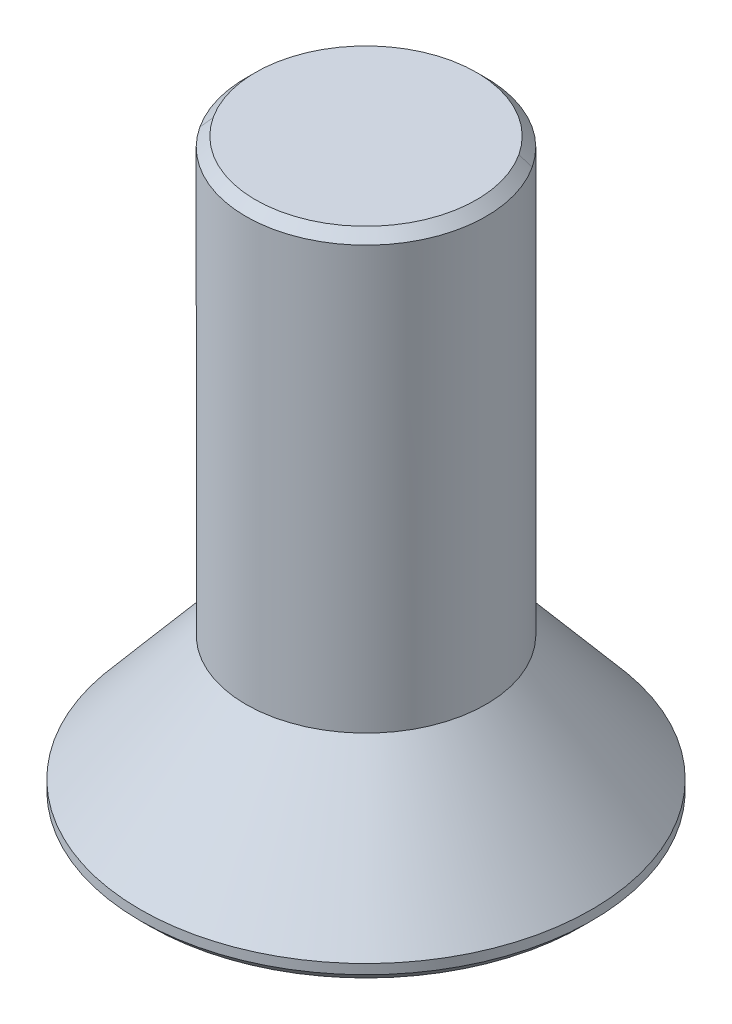
ISO-10303-21;
HEADER;
FILE_DESCRIPTION(('STEP AP214'),'2;1');
FILE_NAME('part.step','',(''),(''),'','','');
FILE_SCHEMA(('AUTOMOTIVE_DESIGN { 1 0 10303 214 1 1 1 1 }'));
ENDSEC;
DATA;
#1=APPLICATION_CONTEXT('core data for automotive mechanical design processes');
#2=APPLICATION_PROTOCOL_DEFINITION('international standard','automotive_design',2000,#1);
#3=PRODUCT_CONTEXT('',#1,'mechanical');
#4=PRODUCT('Part','Part','',(#3));
#5=PRODUCT_RELATED_PRODUCT_CATEGORY('part','',(#4));
#6=PRODUCT_DEFINITION_FORMATION('','',#4);
#7=PRODUCT_DEFINITION_CONTEXT('part definition',#1,'design');
#8=PRODUCT_DEFINITION('design','',#6,#7);
#9=PRODUCT_DEFINITION_SHAPE('','',#8);
#10=(LENGTH_UNIT() NAMED_UNIT(*) SI_UNIT(.MILLI.,.METRE.));
#11=(NAMED_UNIT(*) PLANE_ANGLE_UNIT() SI_UNIT($,.RADIAN.));
#12=(NAMED_UNIT(*) SI_UNIT($,.STERADIAN.) SOLID_ANGLE_UNIT());
#13=UNCERTAINTY_MEASURE_WITH_UNIT(LENGTH_MEASURE(1.E-05),#10,'distance_accuracy_value','');
#14=(GEOMETRIC_REPRESENTATION_CONTEXT(3) GLOBAL_UNCERTAINTY_ASSIGNED_CONTEXT((#13)) GLOBAL_UNIT_ASSIGNED_CONTEXT((#10,
#11,#12)) REPRESENTATION_CONTEXT('',''));
#15=CARTESIAN_POINT('',(0.,0.,0.));
#16=DIRECTION('',(0.,0.,1.));
#17=DIRECTION('',(1.,0.,0.));
#18=AXIS2_PLACEMENT_3D('',#15,#16,#17);
#19=CARTESIAN_POINT('',(11.9,-98.6,10.95));
#20=DIRECTION('',(0.,1.,0.));
#21=DIRECTION('',(0.,0.,1.));
#22=AXIS2_PLACEMENT_3D('',#19,#20,#21);
#23=PLANE('',#22);
#24=DIRECTION('',(0.892252070642868,0.,0.451537642321784));
#25=VECTOR('',#24,1.);
#26=CARTESIAN_POINT('',(11.01856332094,-98.6,11.14837237246));
#27=LINE('',#26,#25);
#28=CARTESIAN_POINT('',(11.2153737278014,-98.6,11.2479712526672));
#29=VERTEX_POINT('',#28);
#30=CARTESIAN_POINT('',(10.8217529140776,-98.6,11.0487734922547));
#31=VERTEX_POINT('',#30);
#32=EDGE_CURVE('E336',#29,#31,#27,.F.);
#33=ORIENTED_EDGE('',*,*,#32,.T.);
#34=CARTESIAN_POINT('',(10.84432979619,-98.6,11.00416088872));
#35=DIRECTION('',(0.,-1.,0.));
#36=DIRECTION('',(0.,0.,-1.));
#37=AXIS2_PLACEMENT_3D('',#34,#35,#36);
#38=CIRCLE('',#37,0.05000000000277);
#39=CARTESIAN_POINT('',(10.8169825892633,-98.6,10.9623024335125));
#40=VERTEX_POINT('',#39);
#41=EDGE_CURVE('E289',#31,#40,#38,.T.);
#42=ORIENTED_EDGE('',*,*,#41,.T.);
#43=DIRECTION('',(0.837169104324096,0.,-0.546944138614897));
#44=VECTOR('',#43,1.);
#45=CARTESIAN_POINT('',(11.00164295314,-98.6,10.84165906154));
#46=LINE('',#45,#44);
#47=CARTESIAN_POINT('',(11.1863033170238,-98.6,10.7210156895684));
#48=VERTEX_POINT('',#47);
#49=EDGE_CURVE('E291',#48,#40,#46,.F.);
#50=ORIENTED_EDGE('',*,*,#49,.F.);
#51=CARTESIAN_POINT('',(11.04956728237,-98.6,10.51172341348));
#52=DIRECTION('',(0.,-1.,0.));
#53=DIRECTION('',(0.,0.,-1.));
#54=AXIS2_PLACEMENT_3D('',#51,#52,#53);
#55=CIRCLE('',#54,0.2500000000109);
#56=CARTESIAN_POINT('',(11.2991877275952,-98.6,10.4979526719071));
#57=VERTEX_POINT('',#56);
#58=EDGE_CURVE('E284',#57,#48,#55,.T.);
#59=ORIENTED_EDGE('',*,*,#58,.F.);
#60=DIRECTION('',(-0.0550829663049418,0.,-0.998481780916932));
#61=VECTOR('',#60,1.);
#62=CARTESIAN_POINT('',(11.28748614651,-98.6,10.28583963034));
#63=LINE('',#62,#61);
#64=CARTESIAN_POINT('',(11.275784565423,-98.6,10.0737265887676));
#65=VERTEX_POINT('',#64);
#66=EDGE_CURVE('E330',#65,#57,#63,.F.);
#67=ORIENTED_EDGE('',*,*,#66,.F.);
#68=CARTESIAN_POINT('',(11.32570865447,-98.6,10.07097244045));
#69=DIRECTION('',(0.,-1.,0.));
#70=DIRECTION('',(0.,0.,-1.));
#71=AXIS2_PLACEMENT_3D('',#68,#69,#70);
#72=CIRCLE('',#71,0.05000000000277);
#73=CARTESIAN_POINT('',(11.3482855365822,-98.6,10.0263598369199));
#74=VERTEX_POINT('',#73);
#75=EDGE_CURVE('E193',#65,#74,#72,.T.);
#76=ORIENTED_EDGE('',*,*,#75,.T.);
#77=DIRECTION('',(0.892252070648825,0.,0.451537642310013));
#78=VECTOR('',#77,1.);
#79=CARTESIAN_POINT('',(11.53783160959,-98.6,10.12228249122));
#80=LINE('',#79,#78);
#81=CARTESIAN_POINT('',(11.7273776826113,-98.6,10.218205145518));
#82=VERTEX_POINT('',#81);
#83=EDGE_CURVE('E189',#82,#74,#80,.F.);
#84=ORIENTED_EDGE('',*,*,#83,.F.);
#85=CARTESIAN_POINT('',(11.84026209319,-98.6,9.995142127854));
#86=DIRECTION('',(0.,-1.,0.));
#87=DIRECTION('',(0.,0.,-1.));
#88=AXIS2_PLACEMENT_3D('',#85,#86,#87);
#89=CIRCLE('',#88,0.2500000000004);
#90=CARTESIAN_POINT('',(11.9769981278429,-98.6,10.2044344039408));
#91=VERTEX_POINT('',#90);
#92=EDGE_CURVE('E20',#91,#82,#89,.T.);
#93=ORIENTED_EDGE('',*,*,#92,.F.);
#94=DIRECTION('',(0.837169104328085,0.,-0.54694413860879));
#95=VECTOR('',#94,1.);
#96=CARTESIAN_POINT('',(12.16165849172,-98.6,10.08379103197));
#97=LINE('',#96,#95);
#98=CARTESIAN_POINT('',(12.3463188555998,-98.6,9.96314765999378));
#99=VERTEX_POINT('',#98);
#100=EDGE_CURVE('E204',#99,#91,#97,.F.);
#101=ORIENTED_EDGE('',*,*,#100,.F.);
#102=CARTESIAN_POINT('',(12.37366606253,-98.6,10.00500611521));
#103=DIRECTION('',(0.,-1.,0.));
#104=DIRECTION('',(0.,0.,-1.));
#105=AXIS2_PLACEMENT_3D('',#102,#103,#104);
#106=CIRCLE('',#105,0.05000000000277);
#107=CARTESIAN_POINT('',(12.423590151574,-98.6,10.0022519668923));
#108=VERTEX_POINT('',#107);
#109=EDGE_CURVE('E323',#99,#108,#106,.T.);
#110=ORIENTED_EDGE('',*,*,#109,.T.);
#111=DIRECTION('',(-0.0550829663170281,0.,-0.998481780916265));
#112=VECTOR('',#111,1.);
#113=CARTESIAN_POINT('',(12.43574019456,-98.6,10.22249421908));
#114=LINE('',#113,#112);
#115=CARTESIAN_POINT('',(12.4478902375452,-98.6,10.4427364712499));
#116=VERTEX_POINT('',#115);
#117=EDGE_CURVE('E221',#108,#116,#114,.F.);
#118=ORIENTED_EDGE('',*,*,#117,.T.);
#119=CARTESIAN_POINT('',(12.69751068278,-98.6,10.42896572967));
#120=DIRECTION('',(0.,-1.,0.));
#121=DIRECTION('',(0.,0.,-1.));
#122=AXIS2_PLACEMENT_3D('',#119,#120,#121);
#123=CIRCLE('',#122,0.2500000000055);
#124=CARTESIAN_POINT('',(12.5846262721986,-98.6,10.6520287473328));
#125=VERTEX_POINT('',#124);
#126=EDGE_CURVE('E320',#125,#116,#123,.T.);
#127=ORIENTED_EDGE('',*,*,#126,.F.);
#128=DIRECTION('',(0.892252070642868,0.,0.451537642321784));
#129=VECTOR('',#128,1.);
#130=CARTESIAN_POINT('',(12.78143667906,-98.6,10.75162762754));
#131=LINE('',#130,#129);
#132=CARTESIAN_POINT('',(12.9782470859224,-98.6,10.8512265077453));
#133=VERTEX_POINT('',#132);
#134=EDGE_CURVE('E349',#133,#125,#131,.F.);
#135=ORIENTED_EDGE('',*,*,#134,.F.);
#136=CARTESIAN_POINT('',(12.95567020381,-98.6,10.89583911128));
#137=DIRECTION('',(0.,-1.,0.));
#138=DIRECTION('',(0.,0.,-1.));
#139=AXIS2_PLACEMENT_3D('',#136,#137,#138);
#140=CIRCLE('',#139,0.05000000000277);
#141=CARTESIAN_POINT('',(12.9830174107344,-98.6,10.937697566489));
#142=VERTEX_POINT('',#141);
#143=EDGE_CURVE('E316',#133,#142,#140,.T.);
#144=ORIENTED_EDGE('',*,*,#143,.T.);
#145=DIRECTION('',(0.837169104324096,0.,-0.546944138614897));
#146=VECTOR('',#145,1.);
#147=CARTESIAN_POINT('',(12.79835704686,-98.6,11.05834093846));
#148=LINE('',#147,#146);
#149=CARTESIAN_POINT('',(12.6136966829777,-98.6,11.1789843104388));
#150=VERTEX_POINT('',#149);
#151=EDGE_CURVE('E315',#142,#150,#148,.F.);
#152=ORIENTED_EDGE('',*,*,#151,.T.);
#153=CARTESIAN_POINT('',(12.75043271763,-98.6,11.38827658652));
#154=DIRECTION('',(0.,-1.,0.));
#155=DIRECTION('',(0.,0.,-1.));
#156=AXIS2_PLACEMENT_3D('',#153,#154,#155);
#157=CIRCLE('',#156,0.2499999999971);
#158=CARTESIAN_POINT('',(12.5008122724051,-98.6,11.4020473280979));
#159=VERTEX_POINT('',#158);
#160=EDGE_CURVE('E311',#159,#150,#157,.T.);
#161=ORIENTED_EDGE('',*,*,#160,.F.);
#162=DIRECTION('',(-0.0550829663049418,0.,-0.998481780916932));
#163=VECTOR('',#162,1.);
#164=CARTESIAN_POINT('',(12.51251385349,-98.6,11.61416036966));
#165=LINE('',#164,#163);
#166=CARTESIAN_POINT('',(12.5242154345728,-98.6,11.8262734112327));
#167=VERTEX_POINT('',#166);
#168=EDGE_CURVE('E346',#159,#167,#165,.F.);
#169=ORIENTED_EDGE('',*,*,#168,.T.);
#170=CARTESIAN_POINT('',(12.47429134553,-98.6,11.82902755955));
#171=DIRECTION('',(0.,-1.,0.));
#172=DIRECTION('',(0.,0.,-1.));
#173=AXIS2_PLACEMENT_3D('',#170,#171,#172);
#174=CIRCLE('',#173,0.0499999999944);
#175=CARTESIAN_POINT('',(12.4517144634186,-98.6,11.8736401630785));
#176=VERTEX_POINT('',#175);
#177=EDGE_CURVE('E307',#167,#176,#174,.T.);
#178=ORIENTED_EDGE('',*,*,#177,.T.);
#179=DIRECTION('',(0.892252070648825,0.,0.451537642310013));
#180=VECTOR('',#179,1.);
#181=CARTESIAN_POINT('',(12.2621683904,-98.6,11.77771750878));
#182=LINE('',#181,#180);
#183=CARTESIAN_POINT('',(12.0726223173888,-98.6,11.6817948544838));
#184=VERTEX_POINT('',#183);
#185=EDGE_CURVE('E306',#176,#184,#182,.F.);
#186=ORIENTED_EDGE('',*,*,#185,.T.);
#187=CARTESIAN_POINT('',(11.95973790681,-98.6,11.90485787215));
#188=DIRECTION('',(0.,-1.,0.));
#189=DIRECTION('',(0.,0.,-1.));
#190=AXIS2_PLACEMENT_3D('',#187,#188,#189);
#191=CIRCLE('',#190,0.2500000000055);
#192=CARTESIAN_POINT('',(11.8230018721545,-98.6,11.6955655960589));
#193=VERTEX_POINT('',#192);
#194=EDGE_CURVE('E302',#193,#184,#191,.T.);
#195=ORIENTED_EDGE('',*,*,#194,.F.);
#196=DIRECTION('',(0.837169104324096,0.,-0.546944138614897));
#197=VECTOR('',#196,1.);
#198=CARTESIAN_POINT('',(11.63834150828,-98.6,11.81620896803));
#199=LINE('',#198,#197);
#200=CARTESIAN_POINT('',(11.4536811443999,-98.6,11.9368523400074));
#201=VERTEX_POINT('',#200);
#202=EDGE_CURVE('E341',#193,#201,#199,.F.);
#203=ORIENTED_EDGE('',*,*,#202,.T.);
#204=CARTESIAN_POINT('',(11.42633393747,-98.6,11.89499388479));
#205=DIRECTION('',(0.,-1.,0.));
#206=DIRECTION('',(0.,0.,-1.));
#207=AXIS2_PLACEMENT_3D('',#204,#205,#206);
#208=CIRCLE('',#207,0.05000000000277);
#209=CARTESIAN_POINT('',(11.3764098484256,-98.6,11.8977480331027));
#210=VERTEX_POINT('',#209);
#211=EDGE_CURVE('E298',#201,#210,#208,.T.);
#212=ORIENTED_EDGE('',*,*,#211,.T.);
#213=DIRECTION('',(-0.0550829663167888,0.,-0.998481780916279));
#214=VECTOR('',#213,1.);
#215=CARTESIAN_POINT('',(11.36425980544,-98.6,11.67750578092));
#216=LINE('',#215,#214);
#217=CARTESIAN_POINT('',(11.3521097624506,-98.6,11.4572635287503));
#218=VERTEX_POINT('',#217);
#219=EDGE_CURVE('E300',#218,#210,#216,.F.);
#220=ORIENTED_EDGE('',*,*,#219,.F.);
#221=CARTESIAN_POINT('',(11.10248931722,-98.6,11.47103427033));
#222=DIRECTION('',(0.,-1.,0.));
#223=DIRECTION('',(0.,0.,-1.));
#224=AXIS2_PLACEMENT_3D('',#221,#222,#223);
#225=CIRCLE('',#224,0.2499999999971);
#226=EDGE_CURVE('E293',#29,#218,#225,.T.);
#227=ORIENTED_EDGE('',*,*,#226,.F.);
#228=EDGE_LOOP('',(#33,#42,#50,#59,#67,#76,#84,#93,#101,#110,#118,#127,#135,#144,#152,#161,#169,
#178,#186,#195,#203,#212,#220,#227));
#229=FACE_BOUND('',#228,.T.);
#230=ADVANCED_FACE('F17',(#229),#23,.F.);
#231=CARTESIAN_POINT('',(11.53783160959,-99.2,10.12228249122));
#232=DIRECTION('',(-0.451537642310013,0.,0.892252070648825));
#233=DIRECTION('',(0.892252070648825,0.,0.451537642310013));
#234=AXIS2_PLACEMENT_3D('',#231,#232,#233);
#235=PLANE('',#234);
#236=DIRECTION('',(0.,-1.,0.));
#237=VECTOR('',#236,1.);
#238=CARTESIAN_POINT('',(11.3482855365834,-98.576,10.0263598369134));
#239=LINE('',#238,#237);
#240=CARTESIAN_POINT('',(11.3482855365837,-99.8,10.0263598369177));
#241=VERTEX_POINT('',#240);
#242=EDGE_CURVE('E282',#74,#241,#239,.T.);
#243=ORIENTED_EDGE('',*,*,#242,.T.);
#244=DIRECTION('',(0.892252070642463,0.,0.451537642322584));
#245=VECTOR('',#244,1.);
#246=CARTESIAN_POINT('',(11.34828553658,-99.8,10.02635983692));
#247=LINE('',#246,#245);
#248=CARTESIAN_POINT('',(11.7273776826096,-99.8,10.2182051455175));
#249=VERTEX_POINT('',#248);
#250=EDGE_CURVE('E201',#241,#249,#247,.T.);
#251=ORIENTED_EDGE('',*,*,#250,.T.);
#252=DIRECTION('',(0.,-1.,0.));
#253=VECTOR('',#252,1.);
#254=CARTESIAN_POINT('',(11.7273776826119,-98.576,10.2182051455163));
#255=LINE('',#254,#253);
#256=EDGE_CURVE('E198',#82,#249,#255,.T.);
#257=ORIENTED_EDGE('',*,*,#256,.F.);
#258=ORIENTED_EDGE('',*,*,#83,.T.);
#259=EDGE_LOOP('',(#243,#251,#257,#258));
#260=FACE_BOUND('',#259,.T.);
#261=ADVANCED_FACE('F199',(#260),#235,.T.);
#262=CARTESIAN_POINT('',(11.84026209319,-98.576,9.995142127854));
#263=DIRECTION('',(0.,-1.,0.));
#264=DIRECTION('',(0.,0.,-1.));
#265=AXIS2_PLACEMENT_3D('',#262,#263,#264);
#266=CYLINDRICAL_SURFACE('',#265,0.2500000000004);
#267=ORIENTED_EDGE('',*,*,#256,.T.);
#268=CARTESIAN_POINT('',(11.84026209319,-99.8,9.995142127854));
#269=DIRECTION('',(0.,-1.,0.));
#270=DIRECTION('',(0.,0.,-1.));
#271=AXIS2_PLACEMENT_3D('',#268,#269,#270);
#272=CIRCLE('',#271,0.2500000000004);
#273=CARTESIAN_POINT('',(11.9769981278424,-99.8,10.2044344039398));
#274=VERTEX_POINT('',#273);
#275=EDGE_CURVE('E210',#249,#274,#272,.F.);
#276=ORIENTED_EDGE('',*,*,#275,.T.);
#277=DIRECTION('',(0.,1.,0.));
#278=VECTOR('',#277,1.);
#279=CARTESIAN_POINT('',(11.9769981278413,-99.2,10.2044344039419));
#280=LINE('',#279,#278);
#281=EDGE_CURVE('E208',#91,#274,#280,.F.);
#282=ORIENTED_EDGE('',*,*,#281,.F.);
#283=ORIENTED_EDGE('',*,*,#92,.T.);
#284=EDGE_LOOP('',(#267,#276,#282,#283));
#285=FACE_BOUND('',#284,.T.);
#286=ADVANCED_FACE('F206',(#285),#266,.T.);
#287=CARTESIAN_POINT('',(12.16165849172,-99.2,10.08379103197));
#288=DIRECTION('',(0.54694413860879,0.,0.837169104328085));
#289=DIRECTION('',(0.837169104328085,0.,-0.54694413860879));
#290=AXIS2_PLACEMENT_3D('',#287,#288,#289);
#291=PLANE('',#290);
#292=ORIENTED_EDGE('',*,*,#281,.T.);
#293=DIRECTION('',(0.83716910432753,0.,-0.546944138609641));
#294=VECTOR('',#293,1.);
#295=CARTESIAN_POINT('',(11.97699812784,-99.8,10.20443440394));
#296=LINE('',#295,#294);
#297=CARTESIAN_POINT('',(12.346318855599,-99.8,9.96314765999265));
#298=VERTEX_POINT('',#297);
#299=EDGE_CURVE('E279',#274,#298,#296,.T.);
#300=ORIENTED_EDGE('',*,*,#299,.T.);
#301=DIRECTION('',(0.,-1.,0.));
#302=VECTOR('',#301,1.);
#303=CARTESIAN_POINT('',(12.3463188555982,-98.576,9.9631476599912));
#304=LINE('',#303,#302);
#305=EDGE_CURVE('E214',#298,#99,#304,.F.);
#306=ORIENTED_EDGE('',*,*,#305,.T.);
#307=ORIENTED_EDGE('',*,*,#100,.T.);
#308=EDGE_LOOP('',(#292,#300,#306,#307));
#309=FACE_BOUND('',#308,.T.);
#310=ADVANCED_FACE('F217',(#309),#291,.T.);
#311=CARTESIAN_POINT('',(12.37366606253,-98.576,10.00500611521));
#312=DIRECTION('',(0.,-1.,0.));
#313=DIRECTION('',(0.,0.,-1.));
#314=AXIS2_PLACEMENT_3D('',#311,#312,#313);
#315=CYLINDRICAL_SURFACE('',#314,0.05000000000277);
#316=ORIENTED_EDGE('',*,*,#109,.F.);
#317=ORIENTED_EDGE('',*,*,#305,.F.);
#318=CARTESIAN_POINT('',(12.37366606253,-99.8,10.00500611521));
#319=DIRECTION('',(0.,-1.,0.));
#320=DIRECTION('',(0.,0.,-1.));
#321=AXIS2_PLACEMENT_3D('',#318,#319,#320);
#322=CIRCLE('',#321,0.05000000000277);
#323=CARTESIAN_POINT('',(12.4235901515771,-99.8,10.0022519668922));
#324=VERTEX_POINT('',#323);
#325=EDGE_CURVE('E277',#298,#324,#322,.T.);
#326=ORIENTED_EDGE('',*,*,#325,.T.);
#327=DIRECTION('',(0.,1.,0.));
#328=VECTOR('',#327,1.);
#329=CARTESIAN_POINT('',(12.4235901515739,-99.2,10.0022519668903));
#330=LINE('',#329,#328);
#331=EDGE_CURVE('E324',#324,#108,#330,.T.);
#332=ORIENTED_EDGE('',*,*,#331,.T.);
#333=EDGE_LOOP('',(#316,#317,#326,#332));
#334=FACE_BOUND('',#333,.T.);
#335=ADVANCED_FACE('F566',(#334),#315,.F.);
#336=CARTESIAN_POINT('',(12.43574019456,-99.2,10.22249421908));
#337=DIRECTION('',(0.998481780916265,0.,-0.0550829663170281));
#338=DIRECTION('',(-0.0550829663170281,0.,-0.998481780916265));
#339=AXIS2_PLACEMENT_3D('',#336,#337,#338);
#340=PLANE('',#339);
#341=ORIENTED_EDGE('',*,*,#117,.F.);
#342=ORIENTED_EDGE('',*,*,#331,.F.);
#343=DIRECTION('',(0.0550829663145629,0.,0.998481780916401));
#344=VECTOR('',#343,1.);
#345=CARTESIAN_POINT('',(12.42359015158,-99.8,10.00225196689));
#346=LINE('',#345,#344);
#347=CARTESIAN_POINT('',(12.4478902375477,-99.8,10.4427364712495));
#348=VERTEX_POINT('',#347);
#349=EDGE_CURVE('E276',#324,#348,#346,.T.);
#350=ORIENTED_EDGE('',*,*,#349,.T.);
#351=DIRECTION('',(0.,-1.,0.));
#352=VECTOR('',#351,1.);
#353=CARTESIAN_POINT('',(12.4478902375455,-98.576,10.4427364712503));
#354=LINE('',#353,#352);
#355=EDGE_CURVE('E322',#116,#348,#354,.T.);
#356=ORIENTED_EDGE('',*,*,#355,.F.);
#357=EDGE_LOOP('',(#341,#342,#350,#356));
#358=FACE_BOUND('',#357,.T.);
#359=ADVANCED_FACE('F563',(#358),#340,.F.);
#360=CARTESIAN_POINT('',(12.69751068278,-98.576,10.42896572967));
#361=DIRECTION('',(0.,-1.,0.));
#362=DIRECTION('',(0.,0.,-1.));
#363=AXIS2_PLACEMENT_3D('',#360,#361,#362);
#364=CYLINDRICAL_SURFACE('',#363,0.2500000000055);
#365=ORIENTED_EDGE('',*,*,#355,.T.);
#366=CARTESIAN_POINT('',(12.69751068278,-99.8,10.42896572967));
#367=DIRECTION('',(0.,-1.,0.));
#368=DIRECTION('',(0.,0.,-1.));
#369=AXIS2_PLACEMENT_3D('',#366,#367,#368);
#370=CIRCLE('',#369,0.2500000000055);
#371=CARTESIAN_POINT('',(12.5846262722002,-99.8,10.6520287473368));
#372=VERTEX_POINT('',#371);
#373=EDGE_CURVE('E274',#348,#372,#370,.F.);
#374=ORIENTED_EDGE('',*,*,#373,.T.);
#375=DIRECTION('',(0.,1.,0.));
#376=VECTOR('',#375,1.);
#377=CARTESIAN_POINT('',(12.5846262721986,-99.2,10.6520287473328));
#378=LINE('',#377,#376);
#379=EDGE_CURVE('E351',#125,#372,#378,.F.);
#380=ORIENTED_EDGE('',*,*,#379,.F.);
#381=ORIENTED_EDGE('',*,*,#126,.T.);
#382=EDGE_LOOP('',(#365,#374,#380,#381));
#383=FACE_BOUND('',#382,.T.);
#384=ADVANCED_FACE('F560',(#383),#364,.T.);
#385=CARTESIAN_POINT('',(12.78143667906,-99.2,10.75162762754));
#386=DIRECTION('',(-0.451537642321784,0.,0.892252070642868));
#387=DIRECTION('',(0.892252070642868,0.,0.451537642321784));
#388=AXIS2_PLACEMENT_3D('',#385,#386,#387);
#389=PLANE('',#388);
#390=ORIENTED_EDGE('',*,*,#379,.T.);
#391=DIRECTION('',(0.89225207065473,0.,0.451537642298344));
#392=VECTOR('',#391,1.);
#393=CARTESIAN_POINT('',(12.5846262722,-99.8,10.65202874734));
#394=LINE('',#393,#392);
#395=CARTESIAN_POINT('',(12.9782470859231,-99.8,10.8512265077424));
#396=VERTEX_POINT('',#395);
#397=EDGE_CURVE('E273',#372,#396,#394,.T.);
#398=ORIENTED_EDGE('',*,*,#397,.T.);
#399=DIRECTION('',(0.,-1.,0.));
#400=VECTOR('',#399,1.);
#401=CARTESIAN_POINT('',(12.9782470859193,-98.576,10.8512265077413));
#402=LINE('',#401,#400);
#403=EDGE_CURVE('E319',#396,#133,#402,.F.);
#404=ORIENTED_EDGE('',*,*,#403,.T.);
#405=ORIENTED_EDGE('',*,*,#134,.T.);
#406=EDGE_LOOP('',(#390,#398,#404,#405));
#407=FACE_BOUND('',#406,.T.);
#408=ADVANCED_FACE('F556',(#407),#389,.T.);
#409=CARTESIAN_POINT('',(12.95567020381,-98.576,10.89583911128));
#410=DIRECTION('',(0.,-1.,0.));
#411=DIRECTION('',(0.,0.,-1.));
#412=AXIS2_PLACEMENT_3D('',#409,#410,#411);
#413=CYLINDRICAL_SURFACE('',#412,0.05000000000277);
#414=ORIENTED_EDGE('',*,*,#143,.F.);
#415=ORIENTED_EDGE('',*,*,#403,.F.);
#416=CARTESIAN_POINT('',(12.95567020381,-99.8,10.89583911128));
#417=DIRECTION('',(0.,-1.,0.));
#418=DIRECTION('',(0.,0.,-1.));
#419=AXIS2_PLACEMENT_3D('',#416,#417,#418);
#420=CIRCLE('',#419,0.05000000000277);
#421=CARTESIAN_POINT('',(12.9830174107374,-99.8,10.9376975664944));
#422=VERTEX_POINT('',#421);
#423=EDGE_CURVE('E271',#396,#422,#420,.T.);
#424=ORIENTED_EDGE('',*,*,#423,.T.);
#425=DIRECTION('',(0.,1.,0.));
#426=VECTOR('',#425,1.);
#427=CARTESIAN_POINT('',(12.9830174107333,-99.2,10.9376975664897));
#428=LINE('',#427,#426);
#429=EDGE_CURVE('E318',#422,#142,#428,.T.);
#430=ORIENTED_EDGE('',*,*,#429,.T.);
#431=EDGE_LOOP('',(#414,#415,#424,#430));
#432=FACE_BOUND('',#431,.T.);
#433=ADVANCED_FACE('F552',(#432),#413,.F.);
#434=CARTESIAN_POINT('',(12.79835704686,-99.2,11.05834093846));
#435=DIRECTION('',(0.546944138614897,0.,0.837169104324096));
#436=DIRECTION('',(0.837169104324096,0.,-0.546944138614897));
#437=AXIS2_PLACEMENT_3D('',#434,#435,#436);
#438=PLANE('',#437);
#439=ORIENTED_EDGE('',*,*,#151,.F.);
#440=ORIENTED_EDGE('',*,*,#429,.F.);
#441=DIRECTION('',(-0.837169104333756,0.,0.54694413860011));
#442=VECTOR('',#441,1.);
#443=CARTESIAN_POINT('',(12.98301741074,-99.8,10.9376975665));
#444=LINE('',#443,#442);
#445=CARTESIAN_POINT('',(12.6136966829808,-99.8,11.1789843104395));
#446=VERTEX_POINT('',#445);
#447=EDGE_CURVE('E270',#422,#446,#444,.T.);
#448=ORIENTED_EDGE('',*,*,#447,.T.);
#449=DIRECTION('',(0.,-1.,0.));
#450=VECTOR('',#449,1.);
#451=CARTESIAN_POINT('',(12.61369668298,-98.576,11.17898431044));
#452=LINE('',#451,#450);
#453=EDGE_CURVE('E314',#150,#446,#452,.T.);
#454=ORIENTED_EDGE('',*,*,#453,.F.);
#455=EDGE_LOOP('',(#439,#440,#448,#454));
#456=FACE_BOUND('',#455,.T.);
#457=ADVANCED_FACE('F548',(#456),#438,.F.);
#458=CARTESIAN_POINT('',(12.75043271763,-98.576,11.38827658652));
#459=DIRECTION('',(0.,-1.,0.));
#460=DIRECTION('',(0.,0.,-1.));
#461=AXIS2_PLACEMENT_3D('',#458,#459,#460);
#462=CYLINDRICAL_SURFACE('',#461,0.2499999999971);
#463=ORIENTED_EDGE('',*,*,#453,.T.);
#464=CARTESIAN_POINT('',(12.75043271763,-99.8,11.38827658652));
#465=DIRECTION('',(0.,-1.,0.));
#466=DIRECTION('',(0.,0.,-1.));
#467=AXIS2_PLACEMENT_3D('',#464,#465,#466);
#468=CIRCLE('',#467,0.2499999999971);
#469=CARTESIAN_POINT('',(12.5008122724027,-99.8,11.4020473281009));
#470=VERTEX_POINT('',#469);
#471=EDGE_CURVE('E268',#446,#470,#468,.F.);
#472=ORIENTED_EDGE('',*,*,#471,.T.);
#473=DIRECTION('',(0.,1.,0.));
#474=VECTOR('',#473,1.);
#475=CARTESIAN_POINT('',(12.5008122724052,-99.2,11.4020473280997));
#476=LINE('',#475,#474);
#477=EDGE_CURVE('E348',#470,#159,#476,.T.);
#478=ORIENTED_EDGE('',*,*,#477,.T.);
#479=ORIENTED_EDGE('',*,*,#160,.T.);
#480=EDGE_LOOP('',(#463,#472,#478,#479));
#481=FACE_BOUND('',#480,.T.);
#482=ADVANCED_FACE('F544',(#481),#462,.T.);
#483=CARTESIAN_POINT('',(12.51251385349,-99.2,11.61416036966));
#484=DIRECTION('',(0.998481780916932,0.,-0.0550829663049418));
#485=DIRECTION('',(-0.0550829663049418,0.,-0.998481780916932));
#486=AXIS2_PLACEMENT_3D('',#483,#484,#485);
#487=PLANE('',#486);
#488=ORIENTED_EDGE('',*,*,#168,.F.);
#489=ORIENTED_EDGE('',*,*,#477,.F.);
#490=DIRECTION('',(0.0550829663280838,0.,0.998481780915656));
#491=VECTOR('',#490,1.);
#492=CARTESIAN_POINT('',(12.5008122724,-99.8,11.4020473281));
#493=LINE('',#492,#491);
#494=CARTESIAN_POINT('',(12.5242154345751,-99.8,11.826273411232));
#495=VERTEX_POINT('',#494);
#496=EDGE_CURVE('E267',#470,#495,#493,.T.);
#497=ORIENTED_EDGE('',*,*,#496,.T.);
#498=DIRECTION('',(0.,-1.,0.));
#499=VECTOR('',#498,1.);
#500=CARTESIAN_POINT('',(12.52421543457,-98.576,11.8262734112306));
#501=LINE('',#500,#499);
#502=EDGE_CURVE('E310',#495,#167,#501,.F.);
#503=ORIENTED_EDGE('',*,*,#502,.T.);
#504=EDGE_LOOP('',(#488,#489,#497,#503));
#505=FACE_BOUND('',#504,.T.);
#506=ADVANCED_FACE('F540',(#505),#487,.F.);
#507=CARTESIAN_POINT('',(12.47429134553,-98.576,11.82902755955));
#508=DIRECTION('',(0.,-1.,0.));
#509=DIRECTION('',(0.,0.,-1.));
#510=AXIS2_PLACEMENT_3D('',#507,#508,#509);
#511=CYLINDRICAL_SURFACE('',#510,0.0499999999944);
#512=ORIENTED_EDGE('',*,*,#177,.F.);
#513=ORIENTED_EDGE('',*,*,#502,.F.);
#514=CARTESIAN_POINT('',(12.47429134553,-99.8,11.82902755955));
#515=DIRECTION('',(0.,-1.,0.));
#516=DIRECTION('',(0.,0.,-1.));
#517=AXIS2_PLACEMENT_3D('',#514,#515,#516);
#518=CIRCLE('',#517,0.0499999999944);
#519=CARTESIAN_POINT('',(12.4517144634182,-99.8,11.8736401630787));
#520=VERTEX_POINT('',#519);
#521=EDGE_CURVE('E265',#495,#520,#518,.T.);
#522=ORIENTED_EDGE('',*,*,#521,.T.);
#523=DIRECTION('',(0.,1.,0.));
#524=VECTOR('',#523,1.);
#525=CARTESIAN_POINT('',(12.4517144634203,-99.2,11.8736401630793));
#526=LINE('',#525,#524);
#527=EDGE_CURVE('E309',#520,#176,#526,.T.);
#528=ORIENTED_EDGE('',*,*,#527,.T.);
#529=EDGE_LOOP('',(#512,#513,#522,#528));
#530=FACE_BOUND('',#529,.T.);
#531=ADVANCED_FACE('F536',(#530),#511,.F.);
#532=CARTESIAN_POINT('',(12.2621683904,-99.2,11.77771750878));
#533=DIRECTION('',(-0.451537642310013,0.,0.892252070648825));
#534=DIRECTION('',(0.892252070648825,0.,0.451537642310013));
#535=AXIS2_PLACEMENT_3D('',#532,#533,#534);
#536=PLANE('',#535);
#537=ORIENTED_EDGE('',*,*,#185,.F.);
#538=ORIENTED_EDGE('',*,*,#527,.F.);
#539=DIRECTION('',(-0.892252070642467,0.,-0.451537642322575));
#540=VECTOR('',#539,1.);
#541=CARTESIAN_POINT('',(12.45171446342,-99.8,11.87364016308));
#542=LINE('',#541,#540);
#543=CARTESIAN_POINT('',(12.0726223173916,-99.8,11.6817948544822));
#544=VERTEX_POINT('',#543);
#545=EDGE_CURVE('E264',#520,#544,#542,.T.);
#546=ORIENTED_EDGE('',*,*,#545,.T.);
#547=DIRECTION('',(0.,-1.,0.));
#548=VECTOR('',#547,1.);
#549=CARTESIAN_POINT('',(12.0726223173888,-98.576,11.6817948544823));
#550=LINE('',#549,#548);
#551=EDGE_CURVE('E305',#184,#544,#550,.T.);
#552=ORIENTED_EDGE('',*,*,#551,.F.);
#553=EDGE_LOOP('',(#537,#538,#546,#552));
#554=FACE_BOUND('',#553,.T.);
#555=ADVANCED_FACE('F532',(#554),#536,.F.);
#556=CARTESIAN_POINT('',(11.95973790681,-98.576,11.90485787215));
#557=DIRECTION('',(0.,-1.,0.));
#558=DIRECTION('',(0.,0.,-1.));
#559=AXIS2_PLACEMENT_3D('',#556,#557,#558);
#560=CYLINDRICAL_SURFACE('',#559,0.2500000000055);
#561=ORIENTED_EDGE('',*,*,#551,.T.);
#562=CARTESIAN_POINT('',(11.95973790681,-99.8,11.90485787215));
#563=DIRECTION('',(0.,-1.,0.));
#564=DIRECTION('',(0.,0.,-1.));
#565=AXIS2_PLACEMENT_3D('',#562,#563,#564);
#566=CIRCLE('',#565,0.2500000000055);
#567=CARTESIAN_POINT('',(11.8230018721554,-99.8,11.6955655960607));
#568=VERTEX_POINT('',#567);
#569=EDGE_CURVE('E262',#544,#568,#566,.F.);
#570=ORIENTED_EDGE('',*,*,#569,.T.);
#571=DIRECTION('',(0.,1.,0.));
#572=VECTOR('',#571,1.);
#573=CARTESIAN_POINT('',(11.8230018721579,-99.2,11.6955655960567));
#574=LINE('',#573,#572);
#575=EDGE_CURVE('E344',#568,#193,#574,.T.);
#576=ORIENTED_EDGE('',*,*,#575,.T.);
#577=ORIENTED_EDGE('',*,*,#194,.T.);
#578=EDGE_LOOP('',(#561,#570,#576,#577));
#579=FACE_BOUND('',#578,.T.);
#580=ADVANCED_FACE('F528',(#579),#560,.T.);
#581=CARTESIAN_POINT('',(11.63834150828,-99.2,11.81620896803));
#582=DIRECTION('',(0.546944138614897,0.,0.837169104324096));
#583=DIRECTION('',(0.837169104324096,0.,-0.546944138614897));
#584=AXIS2_PLACEMENT_3D('',#581,#582,#583);
#585=PLANE('',#584);
#586=ORIENTED_EDGE('',*,*,#202,.F.);
#587=ORIENTED_EDGE('',*,*,#575,.F.);
#588=DIRECTION('',(-0.837169104323378,0.,0.546944138615996));
#589=VECTOR('',#588,1.);
#590=CARTESIAN_POINT('',(11.82300187216,-99.8,11.69556559606));
#591=LINE('',#590,#589);
#592=CARTESIAN_POINT('',(11.4536811444012,-99.8,11.9368523400092));
#593=VERTEX_POINT('',#592);
#594=EDGE_CURVE('E261',#568,#593,#591,.T.);
#595=ORIENTED_EDGE('',*,*,#594,.T.);
#596=DIRECTION('',(0.,-1.,0.));
#597=VECTOR('',#596,1.);
#598=CARTESIAN_POINT('',(11.4536811444,-98.576,11.93685234001));
#599=LINE('',#598,#597);
#600=EDGE_CURVE('E301',#593,#201,#599,.F.);
#601=ORIENTED_EDGE('',*,*,#600,.T.);
#602=EDGE_LOOP('',(#586,#587,#595,#601));
#603=FACE_BOUND('',#602,.T.);
#604=ADVANCED_FACE('F524',(#603),#585,.F.);
#605=CARTESIAN_POINT('',(11.42633393747,-98.576,11.89499388479));
#606=DIRECTION('',(0.,-1.,0.));
#607=DIRECTION('',(0.,0.,-1.));
#608=AXIS2_PLACEMENT_3D('',#605,#606,#607);
#609=CYLINDRICAL_SURFACE('',#608,0.05000000000277);
#610=ORIENTED_EDGE('',*,*,#211,.F.);
#611=ORIENTED_EDGE('',*,*,#600,.F.);
#612=CARTESIAN_POINT('',(11.42633393747,-99.8,11.89499388479));
#613=DIRECTION('',(0.,-1.,0.));
#614=DIRECTION('',(0.,0.,-1.));
#615=AXIS2_PLACEMENT_3D('',#612,#613,#614);
#616=CIRCLE('',#615,0.05000000000277);
#617=CARTESIAN_POINT('',(11.3764098484226,-99.8,11.8977480331028));
#618=VERTEX_POINT('',#617);
#619=EDGE_CURVE('E259',#593,#618,#616,.T.);
#620=ORIENTED_EDGE('',*,*,#619,.T.);
#621=DIRECTION('',(0.,1.,0.));
#622=VECTOR('',#621,1.);
#623=CARTESIAN_POINT('',(11.3764098484255,-99.2,11.8977480330997));
#624=LINE('',#623,#622);
#625=EDGE_CURVE('E297',#210,#618,#624,.F.);
#626=ORIENTED_EDGE('',*,*,#625,.F.);
#627=EDGE_LOOP('',(#610,#611,#620,#626));
#628=FACE_BOUND('',#627,.T.);
#629=ADVANCED_FACE('F520',(#628),#609,.F.);
#630=CARTESIAN_POINT('',(11.36425980544,-99.2,11.67750578092));
#631=DIRECTION('',(0.998481780916279,0.,-0.0550829663167888));
#632=DIRECTION('',(-0.0550829663167888,0.,-0.998481780916279));
#633=AXIS2_PLACEMENT_3D('',#630,#631,#632);
#634=PLANE('',#633);
#635=ORIENTED_EDGE('',*,*,#625,.T.);
#636=DIRECTION('',(-0.055082966314555,0.,-0.998481780916402));
#637=VECTOR('',#636,1.);
#638=CARTESIAN_POINT('',(11.37640984842,-99.8,11.89774803311));
#639=LINE('',#638,#637);
#640=CARTESIAN_POINT('',(11.3521097624481,-99.8,11.4572635287508));
#641=VERTEX_POINT('',#640);
#642=EDGE_CURVE('E258',#618,#641,#639,.T.);
#643=ORIENTED_EDGE('',*,*,#642,.T.);
#644=DIRECTION('',(0.,-1.,0.));
#645=VECTOR('',#644,1.);
#646=CARTESIAN_POINT('',(11.3521097624461,-98.576,11.4572635287502));
#647=LINE('',#646,#645);
#648=EDGE_CURVE('E296',#218,#641,#647,.T.);
#649=ORIENTED_EDGE('',*,*,#648,.F.);
#650=ORIENTED_EDGE('',*,*,#219,.T.);
#651=EDGE_LOOP('',(#635,#643,#649,#650));
#652=FACE_BOUND('',#651,.T.);
#653=ADVANCED_FACE('F516',(#652),#634,.T.);
#654=CARTESIAN_POINT('',(11.10248931722,-98.576,11.47103427033));
#655=DIRECTION('',(0.,-1.,0.));
#656=DIRECTION('',(0.,0.,-1.));
#657=AXIS2_PLACEMENT_3D('',#654,#655,#656);
#658=CYLINDRICAL_SURFACE('',#657,0.2499999999971);
#659=ORIENTED_EDGE('',*,*,#648,.T.);
#660=CARTESIAN_POINT('',(11.10248931722,-99.8,11.47103427033));
#661=DIRECTION('',(0.,-1.,0.));
#662=DIRECTION('',(0.,0.,-1.));
#663=AXIS2_PLACEMENT_3D('',#660,#661,#662);
#664=CIRCLE('',#663,0.2499999999971);
#665=CARTESIAN_POINT('',(11.2153737278001,-99.8,11.2479712526683));
#666=VERTEX_POINT('',#665);
#667=EDGE_CURVE('E256',#641,#666,#664,.F.);
#668=ORIENTED_EDGE('',*,*,#667,.T.);
#669=DIRECTION('',(0.,1.,0.));
#670=VECTOR('',#669,1.);
#671=CARTESIAN_POINT('',(11.2153737278014,-99.2,11.2479712526672));
#672=LINE('',#671,#670);
#673=EDGE_CURVE('E338',#666,#29,#672,.T.);
#674=ORIENTED_EDGE('',*,*,#673,.T.);
#675=ORIENTED_EDGE('',*,*,#226,.T.);
#676=EDGE_LOOP('',(#659,#668,#674,#675));
#677=FACE_BOUND('',#676,.T.);
#678=ADVANCED_FACE('F512',(#677),#658,.T.);
#679=CARTESIAN_POINT('',(11.01856332094,-99.2,11.14837237246));
#680=DIRECTION('',(-0.451537642321784,0.,0.892252070642868));
#681=DIRECTION('',(0.892252070642868,0.,0.451537642321784));
#682=AXIS2_PLACEMENT_3D('',#679,#680,#681);
#683=PLANE('',#682);
#684=ORIENTED_EDGE('',*,*,#32,.F.);
#685=ORIENTED_EDGE('',*,*,#673,.F.);
#686=DIRECTION('',(-0.892252070645598,0.,-0.451537642316388));
#687=VECTOR('',#686,1.);
#688=CARTESIAN_POINT('',(11.2153737278,-99.8,11.24797125267));
#689=LINE('',#688,#687);
#690=CARTESIAN_POINT('',(10.8217529140765,-99.8,11.0487734922574));
#691=VERTEX_POINT('',#690);
#692=EDGE_CURVE('E255',#666,#691,#689,.T.);
#693=ORIENTED_EDGE('',*,*,#692,.T.);
#694=DIRECTION('',(0.,-1.,0.));
#695=VECTOR('',#694,1.);
#696=CARTESIAN_POINT('',(10.8217529140807,-98.576,11.0487734922587));
#697=LINE('',#696,#695);
#698=EDGE_CURVE('E292',#691,#31,#697,.F.);
#699=ORIENTED_EDGE('',*,*,#698,.T.);
#700=EDGE_LOOP('',(#684,#685,#693,#699));
#701=FACE_BOUND('',#700,.T.);
#702=ADVANCED_FACE('F508',(#701),#683,.F.);
#703=CARTESIAN_POINT('',(10.84432979619,-98.576,11.00416088872));
#704=DIRECTION('',(0.,-1.,0.));
#705=DIRECTION('',(0.,0.,-1.));
#706=AXIS2_PLACEMENT_3D('',#703,#704,#705);
#707=CYLINDRICAL_SURFACE('',#706,0.05000000000277);
#708=ORIENTED_EDGE('',*,*,#41,.F.);
#709=ORIENTED_EDGE('',*,*,#698,.F.);
#710=CARTESIAN_POINT('',(10.84432979619,-99.8,11.00416088872));
#711=DIRECTION('',(0.,-1.,0.));
#712=DIRECTION('',(0.,0.,-1.));
#713=AXIS2_PLACEMENT_3D('',#710,#711,#712);
#714=CIRCLE('',#713,0.05000000000277);
#715=CARTESIAN_POINT('',(10.8169825892607,-99.8,10.9623024335069));
#716=VERTEX_POINT('',#715);
#717=EDGE_CURVE('E253',#691,#716,#714,.T.);
#718=ORIENTED_EDGE('',*,*,#717,.T.);
#719=DIRECTION('',(0.,1.,0.));
#720=VECTOR('',#719,1.);
#721=CARTESIAN_POINT('',(10.8169825892621,-99.2,10.9623024335133));
#722=LINE('',#721,#720);
#723=EDGE_CURVE('E288',#40,#716,#722,.F.);
#724=ORIENTED_EDGE('',*,*,#723,.F.);
#725=EDGE_LOOP('',(#708,#709,#718,#724));
#726=FACE_BOUND('',#725,.T.);
#727=ADVANCED_FACE('F504',(#726),#707,.F.);
#728=CARTESIAN_POINT('',(11.00164295314,-99.2,10.84165906154));
#729=DIRECTION('',(0.546944138614897,0.,0.837169104324096));
#730=DIRECTION('',(0.837169104324096,0.,-0.546944138614897));
#731=AXIS2_PLACEMENT_3D('',#728,#729,#730);
#732=PLANE('',#731);
#733=ORIENTED_EDGE('',*,*,#723,.T.);
#734=DIRECTION('',(0.837169104344136,0.,-0.546944138584222));
#735=VECTOR('',#734,1.);
#736=CARTESIAN_POINT('',(10.81698258926,-99.8,10.9623024335));
#737=LINE('',#736,#735);
#738=CARTESIAN_POINT('',(11.186303317021,-99.8,10.7210156895726));
#739=VERTEX_POINT('',#738);
#740=EDGE_CURVE('E252',#716,#739,#737,.T.);
#741=ORIENTED_EDGE('',*,*,#740,.T.);
#742=DIRECTION('',(0.,-1.,0.));
#743=VECTOR('',#742,1.);
#744=CARTESIAN_POINT('',(11.186303317023,-98.576,10.7210156895745));
#745=LINE('',#744,#743);
#746=EDGE_CURVE('E287',#48,#739,#745,.T.);
#747=ORIENTED_EDGE('',*,*,#746,.F.);
#748=ORIENTED_EDGE('',*,*,#49,.T.);
#749=EDGE_LOOP('',(#733,#741,#747,#748));
#750=FACE_BOUND('',#749,.T.);
#751=ADVANCED_FACE('F500',(#750),#732,.T.);
#752=CARTESIAN_POINT('',(11.04956728237,-98.576,10.51172341348));
#753=DIRECTION('',(0.,-1.,0.));
#754=DIRECTION('',(0.,0.,-1.));
#755=AXIS2_PLACEMENT_3D('',#752,#753,#754);
#756=CYLINDRICAL_SURFACE('',#755,0.2500000000109);
#757=ORIENTED_EDGE('',*,*,#746,.T.);
#758=CARTESIAN_POINT('',(11.04956728237,-99.8,10.51172341348));
#759=DIRECTION('',(0.,-1.,0.));
#760=DIRECTION('',(0.,0.,-1.));
#761=AXIS2_PLACEMENT_3D('',#758,#759,#760);
#762=CIRCLE('',#761,0.2500000000109);
#763=CARTESIAN_POINT('',(11.2991877276024,-99.8,10.4979526719009));
#764=VERTEX_POINT('',#763);
#765=EDGE_CURVE('E250',#739,#764,#762,.F.);
#766=ORIENTED_EDGE('',*,*,#765,.T.);
#767=DIRECTION('',(0.,1.,0.));
#768=VECTOR('',#767,1.);
#769=CARTESIAN_POINT('',(11.2991877275954,-99.2,10.4979526719103));
#770=LINE('',#769,#768);
#771=EDGE_CURVE('E333',#57,#764,#770,.F.);
#772=ORIENTED_EDGE('',*,*,#771,.F.);
#773=ORIENTED_EDGE('',*,*,#58,.T.);
#774=EDGE_LOOP('',(#757,#766,#772,#773));
#775=FACE_BOUND('',#774,.T.);
#776=ADVANCED_FACE('F496',(#775),#756,.T.);
#777=CARTESIAN_POINT('',(11.28748614651,-99.2,10.28583963034));
#778=DIRECTION('',(0.998481780916932,0.,-0.0550829663049418));
#779=DIRECTION('',(-0.0550829663049418,0.,-0.998481780916932));
#780=AXIS2_PLACEMENT_3D('',#777,#778,#779);
#781=PLANE('',#780);
#782=ORIENTED_EDGE('',*,*,#771,.T.);
#783=DIRECTION('',(-0.0550829663515464,0.,-0.998481780914361));
#784=VECTOR('',#783,1.);
#785=CARTESIAN_POINT('',(11.29918772761,-99.8,10.4979526719));
#786=LINE('',#785,#784);
#787=CARTESIAN_POINT('',(11.2757845654208,-99.8,10.0737265887689));
#788=VERTEX_POINT('',#787);
#789=EDGE_CURVE('E249',#764,#788,#786,.T.);
#790=ORIENTED_EDGE('',*,*,#789,.T.);
#791=DIRECTION('',(0.,-1.,0.));
#792=VECTOR('',#791,1.);
#793=CARTESIAN_POINT('',(11.2757845654216,-98.576,10.0737265887699));
#794=LINE('',#793,#792);
#795=EDGE_CURVE('E283',#788,#65,#794,.F.);
#796=ORIENTED_EDGE('',*,*,#795,.T.);
#797=ORIENTED_EDGE('',*,*,#66,.T.);
#798=EDGE_LOOP('',(#782,#790,#796,#797));
#799=FACE_BOUND('',#798,.T.);
#800=ADVANCED_FACE('F489',(#799),#781,.T.);
#801=CARTESIAN_POINT('',(11.32570865447,-98.576,10.07097244045));
#802=DIRECTION('',(0.,-1.,0.));
#803=DIRECTION('',(0.,0.,-1.));
#804=AXIS2_PLACEMENT_3D('',#801,#802,#803);
#805=CYLINDRICAL_SURFACE('',#804,0.05000000000277);
#806=ORIENTED_EDGE('',*,*,#75,.F.);
#807=ORIENTED_EDGE('',*,*,#795,.F.);
#808=CARTESIAN_POINT('',(11.32570865447,-99.8,10.07097244045));
#809=DIRECTION('',(0.,-1.,0.));
#810=DIRECTION('',(0.,0.,-1.));
#811=AXIS2_PLACEMENT_3D('',#808,#809,#810);
#812=CIRCLE('',#811,0.05000000000277);
#813=EDGE_CURVE('E246',#788,#241,#812,.T.);
#814=ORIENTED_EDGE('',*,*,#813,.T.);
#815=ORIENTED_EDGE('',*,*,#242,.F.);
#816=EDGE_LOOP('',(#806,#807,#814,#815));
#817=FACE_BOUND('',#816,.T.);
#818=ADVANCED_FACE('F483',(#817),#805,.F.);
#819=CARTESIAN_POINT('',(11.9,-99.8,10.95));
#820=DIRECTION('',(0.,1.,0.));
#821=DIRECTION('',(0.,0.,1.));
#822=AXIS2_PLACEMENT_3D('',#819,#820,#821);
#823=PLANE('',#822);
#824=ORIENTED_EDGE('',*,*,#789,.F.);
#825=ORIENTED_EDGE('',*,*,#765,.F.);
#826=ORIENTED_EDGE('',*,*,#740,.F.);
#827=ORIENTED_EDGE('',*,*,#717,.F.);
#828=ORIENTED_EDGE('',*,*,#692,.F.);
#829=ORIENTED_EDGE('',*,*,#667,.F.);
#830=ORIENTED_EDGE('',*,*,#642,.F.);
#831=ORIENTED_EDGE('',*,*,#619,.F.);
#832=ORIENTED_EDGE('',*,*,#594,.F.);
#833=ORIENTED_EDGE('',*,*,#569,.F.);
#834=ORIENTED_EDGE('',*,*,#545,.F.);
#835=ORIENTED_EDGE('',*,*,#521,.F.);
#836=ORIENTED_EDGE('',*,*,#496,.F.);
#837=ORIENTED_EDGE('',*,*,#471,.F.);
#838=ORIENTED_EDGE('',*,*,#447,.F.);
#839=ORIENTED_EDGE('',*,*,#423,.F.);
#840=ORIENTED_EDGE('',*,*,#397,.F.);
#841=ORIENTED_EDGE('',*,*,#373,.F.);
#842=ORIENTED_EDGE('',*,*,#349,.F.);
#843=ORIENTED_EDGE('',*,*,#325,.F.);
#844=ORIENTED_EDGE('',*,*,#299,.F.);
#845=ORIENTED_EDGE('',*,*,#275,.F.);
#846=ORIENTED_EDGE('',*,*,#250,.F.);
#847=ORIENTED_EDGE('',*,*,#813,.F.);
#848=EDGE_LOOP('',(#824,#825,#826,#827,#828,#829,#830,#831,#832,#833,#834,#835,#836,#837,#838,
#839,#840,#841,#842,#843,#844,#845,#846,#847));
#849=FACE_BOUND('',#848,.T.);
#850=CARTESIAN_POINT('',(11.9,-99.8,10.95));
#851=DIRECTION('',(0.,1.,0.));
#852=DIRECTION('',(0.,0.,1.));
#853=AXIS2_PLACEMENT_3D('',#850,#851,#852);
#854=CIRCLE('',#853,2.25004857152829);
#855=CARTESIAN_POINT('',(11.9,-99.8,13.2000485715283));
#856=VERTEX_POINT('',#855);
#857=EDGE_CURVE('E241',#856,#856,#854,.T.);
#858=ORIENTED_EDGE('',*,*,#857,.F.);
#859=EDGE_LOOP('',(#858));
#860=FACE_BOUND('',#859,.T.);
#861=ADVANCED_FACE('F478',(#849,#860),#823,.F.);
#862=CARTESIAN_POINT('',(11.9,-99.6994052143236,10.95));
#863=DIRECTION('',(0.,1.,0.));
#864=DIRECTION('',(0.,0.,1.));
#865=AXIS2_PLACEMENT_3D('',#862,#863,#864);
#866=CONICAL_SURFACE('',#865,2.3506455287656,0.78540895688683);
#867=CARTESIAN_POINT('',(11.9,-99.7000507291534,10.95));
#868=DIRECTION('',(0.,1.,0.));
#869=DIRECTION('',(0.,0.,1.));
#870=AXIS2_PLACEMENT_3D('',#867,#868,#869);
#871=CIRCLE('',#870,2.350000000001);
#872=CARTESIAN_POINT('',(11.9,-99.7000507291534,13.300000000001));
#873=VERTEX_POINT('',#872);
#874=EDGE_CURVE('E238',#873,#873,#871,.T.);
#875=ORIENTED_EDGE('',*,*,#874,.F.);
#876=EDGE_LOOP('',(#875));
#877=FACE_BOUND('',#876,.T.);
#878=ORIENTED_EDGE('',*,*,#857,.T.);
#879=EDGE_LOOP('',(#878));
#880=FACE_BOUND('',#879,.T.);
#881=ADVANCED_FACE('F473',(#877,#880),#866,.T.);
#882=CARTESIAN_POINT('',(11.9,-99.71073159103,10.95));
#883=DIRECTION('',(0.,1.,0.));
#884=DIRECTION('',(0.,0.,1.));
#885=AXIS2_PLACEMENT_3D('',#882,#883,#884);
#886=CYLINDRICAL_SURFACE('',#885,2.350000000001);
#887=CARTESIAN_POINT('',(11.9,-99.598963978849,10.95));
#888=DIRECTION('',(0.,-1.,0.));
#889=DIRECTION('',(0.546944138601636,0.,0.837169104332759));
#890=AXIS2_PLACEMENT_3D('',#887,#888,#889);
#891=CIRCLE('',#890,2.35000062220488);
#892=CARTESIAN_POINT('',(13.1853190660252,-99.598963978849,12.9173479160727));
#893=VERTEX_POINT('',#892);
#894=EDGE_CURVE('E231',#893,#893,#891,.F.);
#895=ORIENTED_EDGE('',*,*,#894,.F.);
#896=EDGE_LOOP('',(#895));
#897=FACE_BOUND('',#896,.T.);
#898=ORIENTED_EDGE('',*,*,#874,.T.);
#899=EDGE_LOOP('',(#898));
#900=FACE_BOUND('',#899,.T.);
#901=ADVANCED_FACE('F470',(#897,#900),#886,.T.);
#902=CARTESIAN_POINT('',(11.9,-93.9006313213895,10.95));
#903=DIRECTION('',(0.,-1.,0.));
#904=DIRECTION('',(0.,0.,-1.));
#905=AXIS2_PLACEMENT_3D('',#902,#903,#904);
#906=CONICAL_SURFACE('',#905,1.25074958409047,0.785445442316523);
#907=CARTESIAN_POINT('',(11.9,-93.8,10.95));
#908=DIRECTION('',(0.,1.,0.));
#909=DIRECTION('',(0.,0.,1.));
#910=AXIS2_PLACEMENT_3D('',#907,#908,#909);
#911=CIRCLE('',#910,1.15010874677087);
#912=CARTESIAN_POINT('',(12.8628355094234,-93.7999999999937,10.3209547622237));
#913=VERTEX_POINT('',#912);
#914=CARTESIAN_POINT('',(10.9371644904386,-93.7999999999937,11.579045237565));
#915=VERTEX_POINT('',#914);
#916=EDGE_CURVE('E234',#913,#915,#911,.T.);
#917=ORIENTED_EDGE('',*,*,#916,.F.);
#918=CARTESIAN_POINT('',(12.8627220949256,-93.7998645389939,10.3210288588071));
#919=CARTESIAN_POINT('',(12.8662147954917,-93.8040361794939,10.318746991478));
#920=CARTESIAN_POINT('',(12.8697074960948,-93.8082078199843,10.3164651241878));
#921=CARTESIAN_POINT('',(12.8766928973024,-93.8165511009081,10.3119013897055));
#922=CARTESIAN_POINT('',(12.8801855979068,-93.8207227413415,10.3096195225134));
#923=CARTESIAN_POINT('',(12.8871709991626,-93.8290660222556,10.3050557881696));
#924=CARTESIAN_POINT('',(12.890663699814,-93.8332376627362,10.3027739210181));
#925=CARTESIAN_POINT('',(12.8976491011696,-93.8415809436649,10.2982101867714));
#926=CARTESIAN_POINT('',(12.9011418018739,-93.8457525841131,10.2959283196764));
#927=CARTESIAN_POINT('',(12.9081272033099,-93.8540958650387,10.291364585547));
#928=CARTESIAN_POINT('',(12.9116199040414,-93.8582675055163,10.2890827185127));
#929=CARTESIAN_POINT('',(12.9186053055688,-93.866610786489,10.284518984511));
#930=CARTESIAN_POINT('',(12.9220980063646,-93.8707824269841,10.2822371175436));
#931=CARTESIAN_POINT('',(12.9290834079587,-93.8791257079134,10.2776733836817));
#932=CARTESIAN_POINT('',(12.932576108757,-93.8832973483474,10.2753915167872));
#933=CARTESIAN_POINT('',(12.9395615104306,-93.8916406292723,10.2708277830204));
#934=CARTESIAN_POINT('',(12.943054211306,-93.8958122697632,10.2685459161481));
#935=CARTESIAN_POINT('',(12.9465469121909,-93.8999839102621,10.2662640493049));
#936=B_SPLINE_CURVE_WITH_KNOTS('',3,(#918,#919,#920,#921,#922,#923,#924,#925,#926,#927,#928,
#929,#930,#931,#932,#933,#934,#935),.UNSPECIFIED.,.F.,.F.,(4,2,2,2,2,2,2,2,4),(0.,
0.0176996085244696,0.0353992168170889,0.0530988252457296,0.0707984336341777,0.088498042062819,
0.106197650565304,0.123897258857923,0.141596867382393),.UNSPECIFIED.);
#937=CARTESIAN_POINT('',(12.9464969709311,-93.8999946079808,10.2662966370689));
#938=VERTEX_POINT('',#937);
#939=EDGE_CURVE('E35',#913,#938,#936,.T.);
#940=ORIENTED_EDGE('',*,*,#939,.T.);
#941=CARTESIAN_POINT('',(11.9,-93.8998818081687,10.95));
#942=DIRECTION('',(0.,-1.,0.));
#943=DIRECTION('',(0.,0.,-1.));
#944=AXIS2_PLACEMENT_3D('',#941,#942,#943);
#945=CIRCLE('',#944,1.249999999994);
#946=CARTESIAN_POINT('',(10.8535026863698,-93.8999946695099,11.6337030221893));
#947=VERTEX_POINT('',#946);
#948=EDGE_CURVE('E229',#947,#938,#945,.T.);
#949=ORIENTED_EDGE('',*,*,#948,.F.);
#950=CARTESIAN_POINT('',(10.8534528371058,-93.8999839102621,11.633735566961));
#951=CARTESIAN_POINT('',(10.8569447617513,-93.8958132103739,11.6314542318978));
#952=CARTESIAN_POINT('',(10.8604366862724,-93.8916425104882,11.62917289664));
#953=CARTESIAN_POINT('',(10.8674205350285,-93.8833011107735,11.6246102257822));
#954=CARTESIAN_POINT('',(10.8709124592634,-93.8791304109446,11.6223288901822));
#955=CARTESIAN_POINT('',(10.8778963075489,-93.870789011229,11.6177662185959));
#956=CARTESIAN_POINT('',(10.8813882315995,-93.8666183113422,11.6154848826096));
#957=CARTESIAN_POINT('',(10.8883720794042,-93.8582769116064,11.6109222102416));
#958=CARTESIAN_POINT('',(10.8918640031582,-93.8541062117572,11.6086408738599));
#959=CARTESIAN_POINT('',(10.8988478504258,-93.8457648120668,11.6040782007143));
#960=CARTESIAN_POINT('',(10.9023397739395,-93.8415941122254,11.6017968639503));
#961=CARTESIAN_POINT('',(10.9093236207093,-93.8332527125045,11.5972341900827));
#962=CARTESIAN_POINT('',(10.9128155439655,-93.8290820126249,11.594952852979));
#963=CARTESIAN_POINT('',(10.9197993902204,-93.8207406129422,11.5903901783705));
#964=CARTESIAN_POINT('',(10.9232913132191,-93.8165699131391,11.5881088408657));
#965=CARTESIAN_POINT('',(10.9302751590249,-93.8082285134572,11.583546165438));
#966=CARTESIAN_POINT('',(10.9337670818321,-93.8040578135783,11.5812648275152));
#967=CARTESIAN_POINT('',(10.937259004501,-93.7998871136756,11.5789834894243));
#968=B_SPLINE_CURVE_WITH_KNOTS('',3,(#950,#951,#952,#953,#954,#955,#956,#957,#958,#959,#960,
#961,#962,#963,#964,#965,#966,#967),.UNSPECIFIED.,.F.,.F.,(4,2,2,2,2,2,2,2,4),(0.,
0.01769561766687,0.0353912351018883,0.0530868527804199,0.0707824703112615,0.0884780878421004,
0.106173705391145,0.123869322785958,0.141564940486462),.UNSPECIFIED.);
#969=EDGE_CURVE('E237',#947,#915,#968,.T.);
#970=ORIENTED_EDGE('',*,*,#969,.T.);
#971=EDGE_LOOP('',(#917,#940,#949,#970));
#972=FACE_BOUND('',#971,.T.);
#973=ADVANCED_FACE('F430',(#972),#906,.T.);
#974=CARTESIAN_POINT('',(11.9,-93.8,10.95));
#975=DIRECTION('',(0.,1.,0.));
#976=DIRECTION('',(0.,0.,1.));
#977=AXIS2_PLACEMENT_3D('',#974,#975,#976);
#978=PLANE('',#977);
#979=CARTESIAN_POINT('',(11.9,-93.8,10.95));
#980=DIRECTION('',(0.,1.,0.));
#981=DIRECTION('',(0.,0.,1.));
#982=AXIS2_PLACEMENT_3D('',#979,#980,#981);
#983=CIRCLE('',#982,1.15010874677082);
#984=EDGE_CURVE('E226',#913,#915,#983,.F.);
#985=ORIENTED_EDGE('',*,*,#984,.F.);
#986=ORIENTED_EDGE('',*,*,#916,.T.);
#987=EDGE_LOOP('',(#985,#986));
#988=FACE_BOUND('',#987,.T.);
#989=ADVANCED_FACE('F428',(#988),#978,.T.);
#990=CARTESIAN_POINT('',(11.9,-99.598963978849,10.95));
#991=DIRECTION('',(0.,-1.,0.));
#992=DIRECTION('',(1.,0.,0.));
#993=AXIS2_PLACEMENT_3D('',#990,#991,#992);
#994=CONICAL_SURFACE('',#993,2.35000062220488,0.702441047132087);
#995=ORIENTED_EDGE('',*,*,#894,.T.);
#996=EDGE_LOOP('',(#995));
#997=FACE_BOUND('',#996,.T.);
#998=CARTESIAN_POINT('',(11.9,-98.29944853397,10.95));
#999=DIRECTION('',(0.,1.,0.));
#1000=DIRECTION('',(0.,0.,1.));
#1001=AXIS2_PLACEMENT_3D('',#998,#999,#1000);
#1002=CIRCLE('',#1001,1.249999999994);
#1003=CARTESIAN_POINT('',(11.9,-98.29944853397,12.199999999994));
#1004=VERTEX_POINT('',#1003);
#1005=EDGE_CURVE('E26',#1004,#1004,#1002,.T.);
#1006=ORIENTED_EDGE('',*,*,#1005,.F.);
#1007=EDGE_LOOP('',(#1006));
#1008=FACE_BOUND('',#1007,.T.);
#1009=ADVANCED_FACE('F458',(#997,#1008),#994,.T.);
#1010=CARTESIAN_POINT('',(11.9,-93.9005846264536,10.95));
#1011=DIRECTION('',(0.,-1.,0.));
#1012=DIRECTION('',(0.,0.,-1.));
#1013=AXIS2_PLACEMENT_3D('',#1010,#1011,#1012);
#1014=CONICAL_SURFACE('',#1013,1.25070288470629,0.785445442154323);
#1015=ORIENTED_EDGE('',*,*,#939,.F.);
#1016=ORIENTED_EDGE('',*,*,#984,.T.);
#1017=ORIENTED_EDGE('',*,*,#969,.F.);
#1018=CARTESIAN_POINT('',(11.9,-93.8998818082012,10.95));
#1019=DIRECTION('',(0.,-1.,0.));
#1020=DIRECTION('',(0.,0.,-1.));
#1021=AXIS2_PLACEMENT_3D('',#1018,#1019,#1020);
#1022=CIRCLE('',#1021,1.249999999994);
#1023=EDGE_CURVE('E11',#938,#947,#1022,.T.);
#1024=ORIENTED_EDGE('',*,*,#1023,.F.);
#1025=EDGE_LOOP('',(#1015,#1016,#1017,#1024));
#1026=FACE_BOUND('',#1025,.T.);
#1027=ADVANCED_FACE('F448',(#1026),#1014,.T.);
#1028=CARTESIAN_POINT('',(11.9,-98.38743689811,10.95));
#1029=DIRECTION('',(0.,1.,0.));
#1030=DIRECTION('',(0.,0.,1.));
#1031=AXIS2_PLACEMENT_3D('',#1028,#1029,#1030);
#1032=CYLINDRICAL_SURFACE('',#1031,1.249999999994);
#1033=ORIENTED_EDGE('',*,*,#1005,.T.);
#1034=EDGE_LOOP('',(#1033));
#1035=FACE_BOUND('',#1034,.T.);
#1036=ORIENTED_EDGE('',*,*,#1023,.T.);
#1037=ORIENTED_EDGE('',*,*,#948,.T.);
#1038=EDGE_LOOP('',(#1036,#1037));
#1039=FACE_BOUND('',#1038,.T.);
#1040=ADVANCED_FACE('F450',(#1035,#1039),#1032,.T.);
#1041=CLOSED_SHELL('',(#230,#261,#286,#310,#335,#359,#384,#408,#433,#457,#482,#506,#531,#555,
#580,#604,#629,#653,#678,#702,#727,#751,#776,#800,#818,#861,#881,#901,#973,#989,#1009,#1027,#1040));
#1042=MANIFOLD_SOLID_BREP('B1',#1041);
#1043=ADVANCED_BREP_SHAPE_REPRESENTATION('',(#18,#1042),#14);
#1044=SHAPE_DEFINITION_REPRESENTATION(#9,#1043);
ENDSEC;
END-ISO-10303-21;
